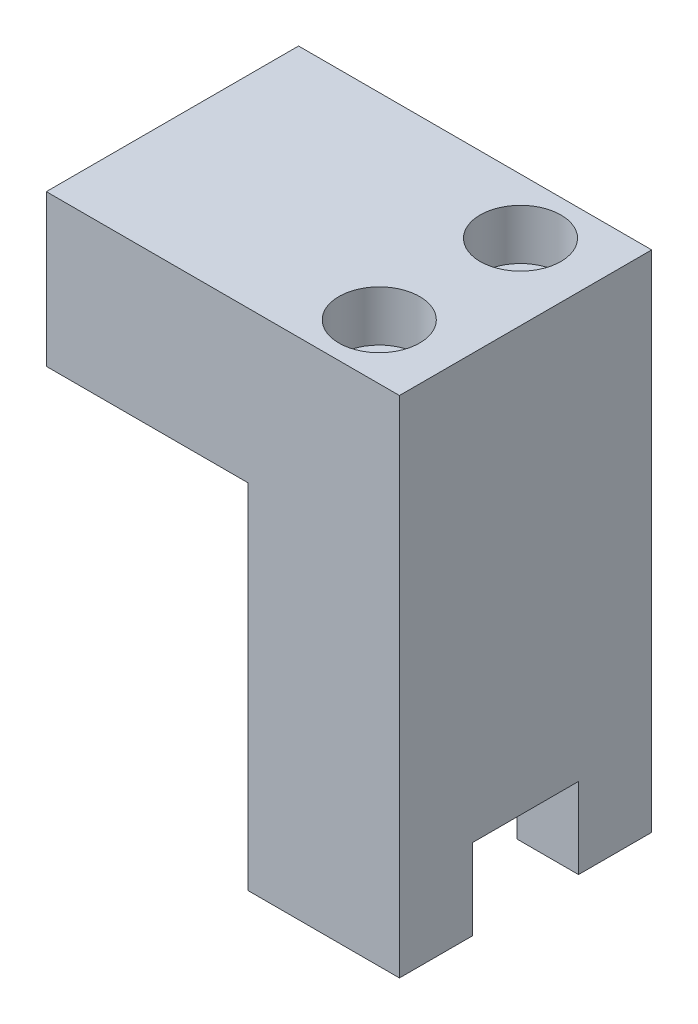
ISO-10303-21;
HEADER;
FILE_DESCRIPTION(('STEP AP214'),'2;1');
FILE_NAME('part.step','',(''),(''),'','','');
FILE_SCHEMA(('AUTOMOTIVE_DESIGN { 1 0 10303 214 1 1 1 1 }'));
ENDSEC;
DATA;
#1=APPLICATION_CONTEXT('core data for automotive mechanical design processes');
#2=APPLICATION_PROTOCOL_DEFINITION('international standard','automotive_design',2000,#1);
#3=PRODUCT_CONTEXT('',#1,'mechanical');
#4=PRODUCT('Part','Part','',(#3));
#5=PRODUCT_RELATED_PRODUCT_CATEGORY('part','',(#4));
#6=PRODUCT_DEFINITION_FORMATION('','',#4);
#7=PRODUCT_DEFINITION_CONTEXT('part definition',#1,'design');
#8=PRODUCT_DEFINITION('design','',#6,#7);
#9=PRODUCT_DEFINITION_SHAPE('','',#8);
#10=(LENGTH_UNIT() NAMED_UNIT(*) SI_UNIT(.MILLI.,.METRE.));
#11=(NAMED_UNIT(*) PLANE_ANGLE_UNIT() SI_UNIT($,.RADIAN.));
#12=(NAMED_UNIT(*) SI_UNIT($,.STERADIAN.) SOLID_ANGLE_UNIT());
#13=UNCERTAINTY_MEASURE_WITH_UNIT(LENGTH_MEASURE(1.E-05),#10,'distance_accuracy_value','');
#14=(GEOMETRIC_REPRESENTATION_CONTEXT(3) GLOBAL_UNCERTAINTY_ASSIGNED_CONTEXT((#13)) GLOBAL_UNIT_ASSIGNED_CONTEXT((#10,
#11,#12)) REPRESENTATION_CONTEXT('',''));
#15=CARTESIAN_POINT('',(0.,0.,0.));
#16=DIRECTION('',(0.,0.,1.));
#17=DIRECTION('',(1.,0.,0.));
#18=AXIS2_PLACEMENT_3D('',#15,#16,#17);
#19=CARTESIAN_POINT('',(35.,-50.,25.));
#20=DIRECTION('',(0.,1.,0.));
#21=DIRECTION('',(0.,0.,1.));
#22=AXIS2_PLACEMENT_3D('',#19,#20,#21);
#23=PLANE('',#22);
#24=DIRECTION('',(0.,0.,-1.));
#25=VECTOR('',#24,1.);
#26=CARTESIAN_POINT('',(35.,-50.,25.));
#27=LINE('',#26,#25);
#28=CARTESIAN_POINT('',(35.,-50.,7.25));
#29=VERTEX_POINT('',#28);
#30=CARTESIAN_POINT('',(35.,-50.,0.));
#31=VERTEX_POINT('',#30);
#32=EDGE_CURVE('E134',#29,#31,#27,.T.);
#33=ORIENTED_EDGE('',*,*,#32,.F.);
#34=DIRECTION('',(-1.,0.,0.));
#35=VECTOR('',#34,1.);
#36=CARTESIAN_POINT('',(35.,-50.,7.25));
#37=LINE('',#36,#35);
#38=CARTESIAN_POINT('',(28.9142135623731,-50.,7.25));
#39=VERTEX_POINT('',#38);
#40=EDGE_CURVE('E245',#29,#39,#37,.T.);
#41=ORIENTED_EDGE('',*,*,#40,.T.);
#42=CARTESIAN_POINT('',(27.5,-50.,5.49999999999999));
#43=DIRECTION('',(0.,1.,0.));
#44=DIRECTION('',(0.,0.,1.));
#45=AXIS2_PLACEMENT_3D('',#42,#43,#44);
#46=CIRCLE('',#45,2.25);
#47=CARTESIAN_POINT('',(26.0857864376269,-50.,7.25));
#48=VERTEX_POINT('',#47);
#49=EDGE_CURVE('E151',#39,#48,#46,.T.);
#50=ORIENTED_EDGE('',*,*,#49,.T.);
#51=CARTESIAN_POINT('',(20.,-50.,7.25));
#52=VERTEX_POINT('',#51);
#53=EDGE_CURVE('E258',#48,#52,#37,.T.);
#54=ORIENTED_EDGE('',*,*,#53,.T.);
#55=DIRECTION('',(0.,0.,-1.));
#56=VECTOR('',#55,1.);
#57=CARTESIAN_POINT('',(20.,-50.,25.));
#58=LINE('',#57,#56);
#59=CARTESIAN_POINT('',(20.,-50.,0.));
#60=VERTEX_POINT('',#59);
#61=EDGE_CURVE('E133',#52,#60,#58,.T.);
#62=ORIENTED_EDGE('',*,*,#61,.T.);
#63=DIRECTION('',(1.,0.,0.));
#64=VECTOR('',#63,1.);
#65=CARTESIAN_POINT('',(35.,-50.,0.));
#66=LINE('',#65,#64);
#67=EDGE_CURVE('E158',#60,#31,#66,.T.);
#68=ORIENTED_EDGE('',*,*,#67,.T.);
#69=EDGE_LOOP('',(#33,#41,#50,#54,#62,#68));
#70=FACE_BOUND('',#69,.T.);
#71=ADVANCED_FACE('F39',(#70),#23,.F.);
#72=CARTESIAN_POINT('',(27.5,-50.,19.5));
#73=DIRECTION('',(0.,1.,0.));
#74=DIRECTION('',(0.,0.,1.));
#75=AXIS2_PLACEMENT_3D('',#72,#73,#74);
#76=CYLINDRICAL_SURFACE('',#75,2.25);
#77=CARTESIAN_POINT('',(27.5,-42.0000000000001,19.5));
#78=DIRECTION('',(0.,1.,0.));
#79=DIRECTION('',(0.,0.,1.));
#80=AXIS2_PLACEMENT_3D('',#77,#78,#79);
#81=CIRCLE('',#80,2.25);
#82=CARTESIAN_POINT('',(26.0857864376269,-42.0000000000001,17.75));
#83=VERTEX_POINT('',#82);
#84=CARTESIAN_POINT('',(28.9142135623731,-42.0000000000001,17.75));
#85=VERTEX_POINT('',#84);
#86=EDGE_CURVE('E354',#83,#85,#81,.F.);
#87=ORIENTED_EDGE('',*,*,#86,.T.);
#88=DIRECTION('',(0.,1.,0.));
#89=VECTOR('',#88,1.);
#90=CARTESIAN_POINT('',(28.9142135623731,-50.,17.75));
#91=LINE('',#90,#89);
#92=CARTESIAN_POINT('',(28.9142135623731,-50.,17.75));
#93=VERTEX_POINT('',#92);
#94=EDGE_CURVE('E360',#85,#93,#91,.F.);
#95=ORIENTED_EDGE('',*,*,#94,.T.);
#96=CARTESIAN_POINT('',(27.5,-50.,19.5));
#97=DIRECTION('',(0.,1.,0.));
#98=DIRECTION('',(0.,0.,1.));
#99=AXIS2_PLACEMENT_3D('',#96,#97,#98);
#100=CIRCLE('',#99,2.25);
#101=CARTESIAN_POINT('',(26.0857864376269,-50.,17.75));
#102=VERTEX_POINT('',#101);
#103=EDGE_CURVE('E188',#102,#93,#100,.T.);
#104=ORIENTED_EDGE('',*,*,#103,.F.);
#105=DIRECTION('',(0.,1.,0.));
#106=VECTOR('',#105,1.);
#107=CARTESIAN_POINT('',(26.0857864376269,-50.,17.75));
#108=LINE('',#107,#106);
#109=EDGE_CURVE('E366',#102,#83,#108,.T.);
#110=ORIENTED_EDGE('',*,*,#109,.T.);
#111=EDGE_LOOP('',(#87,#95,#104,#110));
#112=FACE_BOUND('',#111,.T.);
#113=CARTESIAN_POINT('',(27.5,-5.,19.5));
#114=DIRECTION('',(0.,1.,0.));
#115=DIRECTION('',(0.,0.,1.));
#116=AXIS2_PLACEMENT_3D('',#113,#114,#115);
#117=CIRCLE('',#116,2.25);
#118=CARTESIAN_POINT('',(27.5,-5.,21.75));
#119=VERTEX_POINT('',#118);
#120=EDGE_CURVE('E184',#119,#119,#117,.F.);
#121=ORIENTED_EDGE('',*,*,#120,.F.);
#122=EDGE_LOOP('',(#121));
#123=FACE_BOUND('',#122,.T.);
#124=ADVANCED_FACE('F301',(#112,#123),#76,.F.);
#125=CARTESIAN_POINT('',(27.5,-50.,5.49999999999999));
#126=DIRECTION('',(0.,1.,0.));
#127=DIRECTION('',(0.,0.,1.));
#128=AXIS2_PLACEMENT_3D('',#125,#126,#127);
#129=CYLINDRICAL_SURFACE('',#128,2.25);
#130=CARTESIAN_POINT('',(27.5,-42.0000000000002,5.49999999999999));
#131=DIRECTION('',(0.,1.,0.));
#132=DIRECTION('',(0.,0.,1.));
#133=AXIS2_PLACEMENT_3D('',#130,#131,#132);
#134=CIRCLE('',#133,2.25);
#135=CARTESIAN_POINT('',(28.9142135623731,-42.0000000000002,7.25));
#136=VERTEX_POINT('',#135);
#137=CARTESIAN_POINT('',(26.0857864376269,-42.0000000000002,7.25));
#138=VERTEX_POINT('',#137);
#139=EDGE_CURVE('E264',#136,#138,#134,.F.);
#140=ORIENTED_EDGE('',*,*,#139,.T.);
#141=DIRECTION('',(0.,1.,0.));
#142=VECTOR('',#141,1.);
#143=CARTESIAN_POINT('',(26.0857864376269,-50.,7.25));
#144=LINE('',#143,#142);
#145=EDGE_CURVE('E256',#138,#48,#144,.F.);
#146=ORIENTED_EDGE('',*,*,#145,.T.);
#147=ORIENTED_EDGE('',*,*,#49,.F.);
#148=DIRECTION('',(0.,1.,0.));
#149=VECTOR('',#148,1.);
#150=CARTESIAN_POINT('',(28.9142135623731,-50.,7.25));
#151=LINE('',#150,#149);
#152=EDGE_CURVE('E242',#39,#136,#151,.T.);
#153=ORIENTED_EDGE('',*,*,#152,.T.);
#154=EDGE_LOOP('',(#140,#146,#147,#153));
#155=FACE_BOUND('',#154,.T.);
#156=CARTESIAN_POINT('',(27.5,-5.,5.49999999999999));
#157=DIRECTION('',(0.,1.,0.));
#158=DIRECTION('',(0.,0.,1.));
#159=AXIS2_PLACEMENT_3D('',#156,#157,#158);
#160=CIRCLE('',#159,2.25);
#161=CARTESIAN_POINT('',(27.5,-5.,7.74999999999999));
#162=VERTEX_POINT('',#161);
#163=EDGE_CURVE('E181',#162,#162,#160,.F.);
#164=ORIENTED_EDGE('',*,*,#163,.F.);
#165=EDGE_LOOP('',(#164));
#166=FACE_BOUND('',#165,.T.);
#167=ADVANCED_FACE('F260',(#155,#166),#129,.F.);
#168=CARTESIAN_POINT('',(0.,-15.,25.));
#169=DIRECTION('',(1.,0.,0.));
#170=DIRECTION('',(0.,0.,-1.));
#171=AXIS2_PLACEMENT_3D('',#168,#169,#170);
#172=PLANE('',#171);
#173=DIRECTION('',(0.,-1.,0.));
#174=VECTOR('',#173,1.);
#175=CARTESIAN_POINT('',(0.,-15.,0.));
#176=LINE('',#175,#174);
#177=CARTESIAN_POINT('',(0.,0.,0.));
#178=VERTEX_POINT('',#177);
#179=CARTESIAN_POINT('',(0.,-15.,0.));
#180=VERTEX_POINT('',#179);
#181=EDGE_CURVE('E146',#178,#180,#176,.T.);
#182=ORIENTED_EDGE('',*,*,#181,.T.);
#183=DIRECTION('',(0.,0.,-1.));
#184=VECTOR('',#183,1.);
#185=CARTESIAN_POINT('',(0.,-15.,25.));
#186=LINE('',#185,#184);
#187=CARTESIAN_POINT('',(0.,-15.,25.));
#188=VERTEX_POINT('',#187);
#189=EDGE_CURVE('E48',#188,#180,#186,.T.);
#190=ORIENTED_EDGE('',*,*,#189,.F.);
#191=DIRECTION('',(0.,-1.,0.));
#192=VECTOR('',#191,1.);
#193=CARTESIAN_POINT('',(0.,-15.,25.));
#194=LINE('',#193,#192);
#195=CARTESIAN_POINT('',(0.,0.,25.));
#196=VERTEX_POINT('',#195);
#197=EDGE_CURVE('E167',#196,#188,#194,.T.);
#198=ORIENTED_EDGE('',*,*,#197,.F.);
#199=DIRECTION('',(0.,0.,-1.));
#200=VECTOR('',#199,1.);
#201=CARTESIAN_POINT('',(0.,0.,25.));
#202=LINE('',#201,#200);
#203=EDGE_CURVE('E142',#196,#178,#202,.T.);
#204=ORIENTED_EDGE('',*,*,#203,.T.);
#205=EDGE_LOOP('',(#182,#190,#198,#204));
#206=FACE_BOUND('',#205,.T.);
#207=ADVANCED_FACE('F41',(#206),#172,.F.);
#208=CARTESIAN_POINT('',(20.,-15.,25.));
#209=DIRECTION('',(0.,1.,0.));
#210=DIRECTION('',(-1.,0.,0.));
#211=AXIS2_PLACEMENT_3D('',#208,#209,#210);
#212=PLANE('',#211);
#213=DIRECTION('',(1.,0.,0.));
#214=VECTOR('',#213,1.);
#215=CARTESIAN_POINT('',(20.,-15.,0.));
#216=LINE('',#215,#214);
#217=CARTESIAN_POINT('',(20.,-15.,0.));
#218=VERTEX_POINT('',#217);
#219=EDGE_CURVE('E150',#180,#218,#216,.T.);
#220=ORIENTED_EDGE('',*,*,#219,.T.);
#221=DIRECTION('',(0.,0.,-1.));
#222=VECTOR('',#221,1.);
#223=CARTESIAN_POINT('',(20.,-15.,25.));
#224=LINE('',#223,#222);
#225=CARTESIAN_POINT('',(20.,-15.,25.));
#226=VERTEX_POINT('',#225);
#227=EDGE_CURVE('E175',#226,#218,#224,.T.);
#228=ORIENTED_EDGE('',*,*,#227,.F.);
#229=DIRECTION('',(1.,0.,0.));
#230=VECTOR('',#229,1.);
#231=CARTESIAN_POINT('',(20.,-15.,25.));
#232=LINE('',#231,#230);
#233=EDGE_CURVE('E100',#188,#226,#232,.T.);
#234=ORIENTED_EDGE('',*,*,#233,.F.);
#235=ORIENTED_EDGE('',*,*,#189,.T.);
#236=EDGE_LOOP('',(#220,#228,#234,#235));
#237=FACE_BOUND('',#236,.T.);
#238=ADVANCED_FACE('F207',(#237),#212,.F.);
#239=CARTESIAN_POINT('',(20.,-50.,25.));
#240=DIRECTION('',(1.,0.,0.));
#241=DIRECTION('',(0.,1.,0.));
#242=AXIS2_PLACEMENT_3D('',#239,#240,#241);
#243=PLANE('',#242);
#244=ORIENTED_EDGE('',*,*,#61,.F.);
#245=DIRECTION('',(0.,1.,0.));
#246=VECTOR('',#245,1.);
#247=CARTESIAN_POINT('',(20.,-50.,7.25));
#248=LINE('',#247,#246);
#249=CARTESIAN_POINT('',(20.,-42.0000000000002,7.25));
#250=VERTEX_POINT('',#249);
#251=EDGE_CURVE('E237',#52,#250,#248,.T.);
#252=ORIENTED_EDGE('',*,*,#251,.T.);
#253=DIRECTION('',(0.,0.,1.));
#254=VECTOR('',#253,1.);
#255=CARTESIAN_POINT('',(20.,-42.0000000000001,25.));
#256=LINE('',#255,#254);
#257=CARTESIAN_POINT('',(20.,-42.0000000000001,17.75));
#258=VERTEX_POINT('',#257);
#259=EDGE_CURVE('E349',#250,#258,#256,.T.);
#260=ORIENTED_EDGE('',*,*,#259,.T.);
#261=DIRECTION('',(0.,-1.,0.));
#262=VECTOR('',#261,1.);
#263=CARTESIAN_POINT('',(20.,-50.,17.75));
#264=LINE('',#263,#262);
#265=CARTESIAN_POINT('',(20.,-50.,17.75));
#266=VERTEX_POINT('',#265);
#267=EDGE_CURVE('E216',#258,#266,#264,.T.);
#268=ORIENTED_EDGE('',*,*,#267,.T.);
#269=CARTESIAN_POINT('',(20.,-50.,25.));
#270=VERTEX_POINT('',#269);
#271=EDGE_CURVE('E172',#270,#266,#58,.T.);
#272=ORIENTED_EDGE('',*,*,#271,.F.);
#273=DIRECTION('',(0.,-1.,0.));
#274=VECTOR('',#273,1.);
#275=CARTESIAN_POINT('',(20.,-50.,25.));
#276=LINE('',#275,#274);
#277=EDGE_CURVE('E116',#226,#270,#276,.T.);
#278=ORIENTED_EDGE('',*,*,#277,.F.);
#279=ORIENTED_EDGE('',*,*,#227,.T.);
#280=DIRECTION('',(0.,-1.,0.));
#281=VECTOR('',#280,1.);
#282=CARTESIAN_POINT('',(20.,-50.,0.));
#283=LINE('',#282,#281);
#284=EDGE_CURVE('E154',#218,#60,#283,.T.);
#285=ORIENTED_EDGE('',*,*,#284,.T.);
#286=EDGE_LOOP('',(#244,#252,#260,#268,#272,#278,#279,#285));
#287=FACE_BOUND('',#286,.T.);
#288=ADVANCED_FACE('F211',(#287),#243,.F.);
#289=ORIENTED_EDGE('',*,*,#271,.T.);
#290=DIRECTION('',(1.,0.,0.));
#291=VECTOR('',#290,1.);
#292=CARTESIAN_POINT('',(35.,-50.,17.75));
#293=LINE('',#292,#291);
#294=EDGE_CURVE('E219',#266,#102,#293,.T.);
#295=ORIENTED_EDGE('',*,*,#294,.T.);
#296=ORIENTED_EDGE('',*,*,#103,.T.);
#297=CARTESIAN_POINT('',(35.,-50.,17.75));
#298=VERTEX_POINT('',#297);
#299=EDGE_CURVE('E129',#93,#298,#293,.T.);
#300=ORIENTED_EDGE('',*,*,#299,.T.);
#301=CARTESIAN_POINT('',(35.,-50.,25.));
#302=VERTEX_POINT('',#301);
#303=EDGE_CURVE('E124',#302,#298,#27,.T.);
#304=ORIENTED_EDGE('',*,*,#303,.F.);
#305=DIRECTION('',(1.,0.,0.));
#306=VECTOR('',#305,1.);
#307=CARTESIAN_POINT('',(35.,-50.,25.));
#308=LINE('',#307,#306);
#309=EDGE_CURVE('E109',#270,#302,#308,.T.);
#310=ORIENTED_EDGE('',*,*,#309,.F.);
#311=EDGE_LOOP('',(#289,#295,#296,#300,#304,#310));
#312=FACE_BOUND('',#311,.T.);
#313=ADVANCED_FACE('F125',(#312),#23,.F.);
#314=CARTESIAN_POINT('',(35.,0.,25.));
#315=DIRECTION('',(-1.,0.,0.));
#316=DIRECTION('',(0.,-1.,0.));
#317=AXIS2_PLACEMENT_3D('',#314,#315,#316);
#318=PLANE('',#317);
#319=DIRECTION('',(0.,0.,1.));
#320=VECTOR('',#319,1.);
#321=CARTESIAN_POINT('',(35.,-42.0000000000001,17.75));
#322=LINE('',#321,#320);
#323=CARTESIAN_POINT('',(35.,-42.0000000000002,7.25));
#324=VERTEX_POINT('',#323);
#325=CARTESIAN_POINT('',(35.,-42.0000000000001,17.75));
#326=VERTEX_POINT('',#325);
#327=EDGE_CURVE('E331',#324,#326,#322,.T.);
#328=ORIENTED_EDGE('',*,*,#327,.F.);
#329=DIRECTION('',(0.,-1.,0.));
#330=VECTOR('',#329,1.);
#331=CARTESIAN_POINT('',(35.,0.,7.25));
#332=LINE('',#331,#330);
#333=EDGE_CURVE('E11',#324,#29,#332,.T.);
#334=ORIENTED_EDGE('',*,*,#333,.T.);
#335=ORIENTED_EDGE('',*,*,#32,.T.);
#336=DIRECTION('',(0.,1.,0.));
#337=VECTOR('',#336,1.);
#338=CARTESIAN_POINT('',(35.,0.,0.));
#339=LINE('',#338,#337);
#340=CARTESIAN_POINT('',(35.,0.,0.));
#341=VERTEX_POINT('',#340);
#342=EDGE_CURVE('E162',#31,#341,#339,.T.);
#343=ORIENTED_EDGE('',*,*,#342,.T.);
#344=DIRECTION('',(0.,0.,-1.));
#345=VECTOR('',#344,1.);
#346=CARTESIAN_POINT('',(35.,0.,25.));
#347=LINE('',#346,#345);
#348=CARTESIAN_POINT('',(35.,0.,25.));
#349=VERTEX_POINT('',#348);
#350=EDGE_CURVE('E138',#349,#341,#347,.T.);
#351=ORIENTED_EDGE('',*,*,#350,.F.);
#352=DIRECTION('',(0.,1.,0.));
#353=VECTOR('',#352,1.);
#354=CARTESIAN_POINT('',(35.,0.,25.));
#355=LINE('',#354,#353);
#356=EDGE_CURVE('E113',#302,#349,#355,.T.);
#357=ORIENTED_EDGE('',*,*,#356,.F.);
#358=ORIENTED_EDGE('',*,*,#303,.T.);
#359=DIRECTION('',(0.,-1.,0.));
#360=VECTOR('',#359,1.);
#361=CARTESIAN_POINT('',(35.,-58.0000000000002,17.75));
#362=LINE('',#361,#360);
#363=EDGE_CURVE('E334',#326,#298,#362,.T.);
#364=ORIENTED_EDGE('',*,*,#363,.F.);
#365=EDGE_LOOP('',(#328,#334,#335,#343,#351,#357,#358,#364));
#366=FACE_BOUND('',#365,.T.);
#367=ADVANCED_FACE('F137',(#366),#318,.F.);
#368=CARTESIAN_POINT('',(0.,0.,25.));
#369=DIRECTION('',(0.,-1.,0.));
#370=DIRECTION('',(0.,0.,-1.));
#371=AXIS2_PLACEMENT_3D('',#368,#369,#370);
#372=PLANE('',#371);
#373=CARTESIAN_POINT('',(27.5,0.,5.49999999999999));
#374=DIRECTION('',(0.,1.,0.));
#375=DIRECTION('',(0.,0.,1.));
#376=AXIS2_PLACEMENT_3D('',#373,#374,#375);
#377=CIRCLE('',#376,4.);
#378=CARTESIAN_POINT('',(27.5,0.,9.49999999999999));
#379=VERTEX_POINT('',#378);
#380=EDGE_CURVE('E274',#379,#379,#377,.T.);
#381=ORIENTED_EDGE('',*,*,#380,.F.);
#382=EDGE_LOOP('',(#381));
#383=FACE_BOUND('',#382,.T.);
#384=CARTESIAN_POINT('',(27.5,0.,19.5));
#385=DIRECTION('',(0.,1.,0.));
#386=DIRECTION('',(0.,0.,1.));
#387=AXIS2_PLACEMENT_3D('',#384,#385,#386);
#388=CIRCLE('',#387,4.);
#389=CARTESIAN_POINT('',(27.5,0.,23.5));
#390=VERTEX_POINT('',#389);
#391=EDGE_CURVE('E251',#390,#390,#388,.T.);
#392=ORIENTED_EDGE('',*,*,#391,.F.);
#393=EDGE_LOOP('',(#392));
#394=FACE_BOUND('',#393,.T.);
#395=DIRECTION('',(-1.,0.,0.));
#396=VECTOR('',#395,1.);
#397=CARTESIAN_POINT('',(0.,0.,0.));
#398=LINE('',#397,#396);
#399=EDGE_CURVE('E91',#341,#178,#398,.T.);
#400=ORIENTED_EDGE('',*,*,#399,.T.);
#401=ORIENTED_EDGE('',*,*,#203,.F.);
#402=DIRECTION('',(-1.,0.,0.));
#403=VECTOR('',#402,1.);
#404=CARTESIAN_POINT('',(0.,0.,25.));
#405=LINE('',#404,#403);
#406=EDGE_CURVE('E64',#349,#196,#405,.T.);
#407=ORIENTED_EDGE('',*,*,#406,.F.);
#408=ORIENTED_EDGE('',*,*,#350,.T.);
#409=EDGE_LOOP('',(#400,#401,#407,#408));
#410=FACE_BOUND('',#409,.T.);
#411=ADVANCED_FACE('F287',(#383,#394,#410),#372,.F.);
#412=CARTESIAN_POINT('',(0.,0.,25.));
#413=DIRECTION('',(0.,0.,-1.));
#414=DIRECTION('',(-1.,0.,0.));
#415=AXIS2_PLACEMENT_3D('',#412,#413,#414);
#416=PLANE('',#415);
#417=ORIENTED_EDGE('',*,*,#197,.T.);
#418=ORIENTED_EDGE('',*,*,#233,.T.);
#419=ORIENTED_EDGE('',*,*,#277,.T.);
#420=ORIENTED_EDGE('',*,*,#309,.T.);
#421=ORIENTED_EDGE('',*,*,#356,.T.);
#422=ORIENTED_EDGE('',*,*,#406,.T.);
#423=EDGE_LOOP('',(#417,#418,#419,#420,#421,#422));
#424=FACE_BOUND('',#423,.T.);
#425=ADVANCED_FACE('F111',(#424),#416,.F.);
#426=CARTESIAN_POINT('',(0.,0.,0.));
#427=DIRECTION('',(0.,0.,-1.));
#428=DIRECTION('',(-1.,0.,0.));
#429=AXIS2_PLACEMENT_3D('',#426,#427,#428);
#430=PLANE('',#429);
#431=ORIENTED_EDGE('',*,*,#181,.F.);
#432=ORIENTED_EDGE('',*,*,#399,.F.);
#433=ORIENTED_EDGE('',*,*,#342,.F.);
#434=ORIENTED_EDGE('',*,*,#67,.F.);
#435=ORIENTED_EDGE('',*,*,#284,.F.);
#436=ORIENTED_EDGE('',*,*,#219,.F.);
#437=EDGE_LOOP('',(#431,#432,#433,#434,#435,#436));
#438=FACE_BOUND('',#437,.T.);
#439=ADVANCED_FACE('F295',(#438),#430,.T.);
#440=CARTESIAN_POINT('',(27.5,-5.,5.49999999999999));
#441=DIRECTION('',(0.,1.,0.));
#442=DIRECTION('',(0.,0.,1.));
#443=AXIS2_PLACEMENT_3D('',#440,#441,#442);
#444=PLANE('',#443);
#445=CARTESIAN_POINT('',(27.5,-5.,5.49999999999999));
#446=DIRECTION('',(0.,1.,0.));
#447=DIRECTION('',(0.,0.,1.));
#448=AXIS2_PLACEMENT_3D('',#445,#446,#447);
#449=CIRCLE('',#448,4.);
#450=CARTESIAN_POINT('',(27.5,-5.,9.49999999999999));
#451=VERTEX_POINT('',#450);
#452=EDGE_CURVE('E185',#451,#451,#449,.T.);
#453=ORIENTED_EDGE('',*,*,#452,.T.);
#454=EDGE_LOOP('',(#453));
#455=FACE_BOUND('',#454,.T.);
#456=ORIENTED_EDGE('',*,*,#163,.T.);
#457=EDGE_LOOP('',(#456));
#458=FACE_BOUND('',#457,.T.);
#459=ADVANCED_FACE('F383',(#455,#458),#444,.T.);
#460=CARTESIAN_POINT('',(27.5,-5.,5.49999999999999));
#461=DIRECTION('',(0.,1.,0.));
#462=DIRECTION('',(0.,0.,1.));
#463=AXIS2_PLACEMENT_3D('',#460,#461,#462);
#464=CYLINDRICAL_SURFACE('',#463,4.);
#465=ORIENTED_EDGE('',*,*,#452,.F.);
#466=EDGE_LOOP('',(#465));
#467=FACE_BOUND('',#466,.T.);
#468=ORIENTED_EDGE('',*,*,#380,.T.);
#469=EDGE_LOOP('',(#468));
#470=FACE_BOUND('',#469,.T.);
#471=ADVANCED_FACE('F386',(#467,#470),#464,.F.);
#472=CARTESIAN_POINT('',(27.5,-5.,19.5));
#473=DIRECTION('',(0.,1.,0.));
#474=DIRECTION('',(0.,0.,1.));
#475=AXIS2_PLACEMENT_3D('',#472,#473,#474);
#476=PLANE('',#475);
#477=CARTESIAN_POINT('',(27.5,-5.,19.5));
#478=DIRECTION('',(0.,1.,0.));
#479=DIRECTION('',(0.,0.,1.));
#480=AXIS2_PLACEMENT_3D('',#477,#478,#479);
#481=CIRCLE('',#480,4.);
#482=CARTESIAN_POINT('',(27.5,-5.,23.5));
#483=VERTEX_POINT('',#482);
#484=EDGE_CURVE('E278',#483,#483,#481,.T.);
#485=ORIENTED_EDGE('',*,*,#484,.T.);
#486=EDGE_LOOP('',(#485));
#487=FACE_BOUND('',#486,.T.);
#488=ORIENTED_EDGE('',*,*,#120,.T.);
#489=EDGE_LOOP('',(#488));
#490=FACE_BOUND('',#489,.T.);
#491=ADVANCED_FACE('F390',(#487,#490),#476,.T.);
#492=CARTESIAN_POINT('',(27.5,-5.,19.5));
#493=DIRECTION('',(0.,1.,0.));
#494=DIRECTION('',(0.,0.,1.));
#495=AXIS2_PLACEMENT_3D('',#492,#493,#494);
#496=CYLINDRICAL_SURFACE('',#495,4.);
#497=ORIENTED_EDGE('',*,*,#484,.F.);
#498=EDGE_LOOP('',(#497));
#499=FACE_BOUND('',#498,.T.);
#500=ORIENTED_EDGE('',*,*,#391,.T.);
#501=EDGE_LOOP('',(#500));
#502=FACE_BOUND('',#501,.T.);
#503=ADVANCED_FACE('F285',(#499,#502),#496,.F.);
#504=CARTESIAN_POINT('',(0.,-58.0000000000002,7.25));
#505=DIRECTION('',(0.,0.,-1.));
#506=DIRECTION('',(-1.,0.,0.));
#507=AXIS2_PLACEMENT_3D('',#504,#505,#506);
#508=PLANE('',#507);
#509=ORIENTED_EDGE('',*,*,#40,.F.);
#510=ORIENTED_EDGE('',*,*,#333,.F.);
#511=DIRECTION('',(1.,0.,0.));
#512=VECTOR('',#511,1.);
#513=CARTESIAN_POINT('',(0.,-42.0000000000002,7.25));
#514=LINE('',#513,#512);
#515=EDGE_CURVE('E55',#136,#324,#514,.T.);
#516=ORIENTED_EDGE('',*,*,#515,.F.);
#517=ORIENTED_EDGE('',*,*,#152,.F.);
#518=EDGE_LOOP('',(#509,#510,#516,#517));
#519=FACE_BOUND('',#518,.T.);
#520=ADVANCED_FACE('F244',(#519),#508,.F.);
#521=EDGE_CURVE('E346',#250,#138,#514,.T.);
#522=ORIENTED_EDGE('',*,*,#521,.F.);
#523=ORIENTED_EDGE('',*,*,#251,.F.);
#524=ORIENTED_EDGE('',*,*,#53,.F.);
#525=ORIENTED_EDGE('',*,*,#145,.F.);
#526=EDGE_LOOP('',(#522,#523,#524,#525));
#527=FACE_BOUND('',#526,.T.);
#528=ADVANCED_FACE('F370',(#527),#508,.F.);
#529=CARTESIAN_POINT('',(0.,-58.0000000000002,17.75));
#530=DIRECTION('',(0.,0.,1.));
#531=DIRECTION('',(1.,0.,0.));
#532=AXIS2_PLACEMENT_3D('',#529,#530,#531);
#533=PLANE('',#532);
#534=ORIENTED_EDGE('',*,*,#294,.F.);
#535=ORIENTED_EDGE('',*,*,#267,.F.);
#536=DIRECTION('',(1.,0.,0.));
#537=VECTOR('',#536,1.);
#538=CARTESIAN_POINT('',(0.,-42.0000000000002,17.75));
#539=LINE('',#538,#537);
#540=EDGE_CURVE('E345',#258,#83,#539,.T.);
#541=ORIENTED_EDGE('',*,*,#540,.T.);
#542=ORIENTED_EDGE('',*,*,#109,.F.);
#543=EDGE_LOOP('',(#534,#535,#541,#542));
#544=FACE_BOUND('',#543,.T.);
#545=ADVANCED_FACE('F372',(#544),#533,.F.);
#546=EDGE_CURVE('E341',#85,#326,#539,.T.);
#547=ORIENTED_EDGE('',*,*,#546,.T.);
#548=ORIENTED_EDGE('',*,*,#363,.T.);
#549=ORIENTED_EDGE('',*,*,#299,.F.);
#550=ORIENTED_EDGE('',*,*,#94,.F.);
#551=EDGE_LOOP('',(#547,#548,#549,#550));
#552=FACE_BOUND('',#551,.T.);
#553=ADVANCED_FACE('F378',(#552),#533,.F.);
#554=CARTESIAN_POINT('',(0.,-42.0000000000002,17.75));
#555=DIRECTION('',(0.,1.,0.));
#556=DIRECTION('',(0.,0.,1.));
#557=AXIS2_PLACEMENT_3D('',#554,#555,#556);
#558=PLANE('',#557);
#559=ORIENTED_EDGE('',*,*,#540,.F.);
#560=ORIENTED_EDGE('',*,*,#259,.F.);
#561=ORIENTED_EDGE('',*,*,#521,.T.);
#562=ORIENTED_EDGE('',*,*,#139,.F.);
#563=ORIENTED_EDGE('',*,*,#515,.T.);
#564=ORIENTED_EDGE('',*,*,#327,.T.);
#565=ORIENTED_EDGE('',*,*,#546,.F.);
#566=ORIENTED_EDGE('',*,*,#86,.F.);
#567=EDGE_LOOP('',(#559,#560,#561,#562,#563,#564,#565,#566));
#568=FACE_BOUND('',#567,.T.);
#569=ADVANCED_FACE('F382',(#568),#558,.F.);
#570=CLOSED_SHELL('',(#71,#124,#167,#207,#238,#288,#313,#367,#411,#425,#439,#459,#471,#491,#503,
#520,#528,#545,#553,#569));
#571=MANIFOLD_SOLID_BREP('B2',#570);
#572=ADVANCED_BREP_SHAPE_REPRESENTATION('',(#18,#571),#14);
#573=SHAPE_DEFINITION_REPRESENTATION(#9,#572);
ENDSEC;
END-ISO-10303-21;
